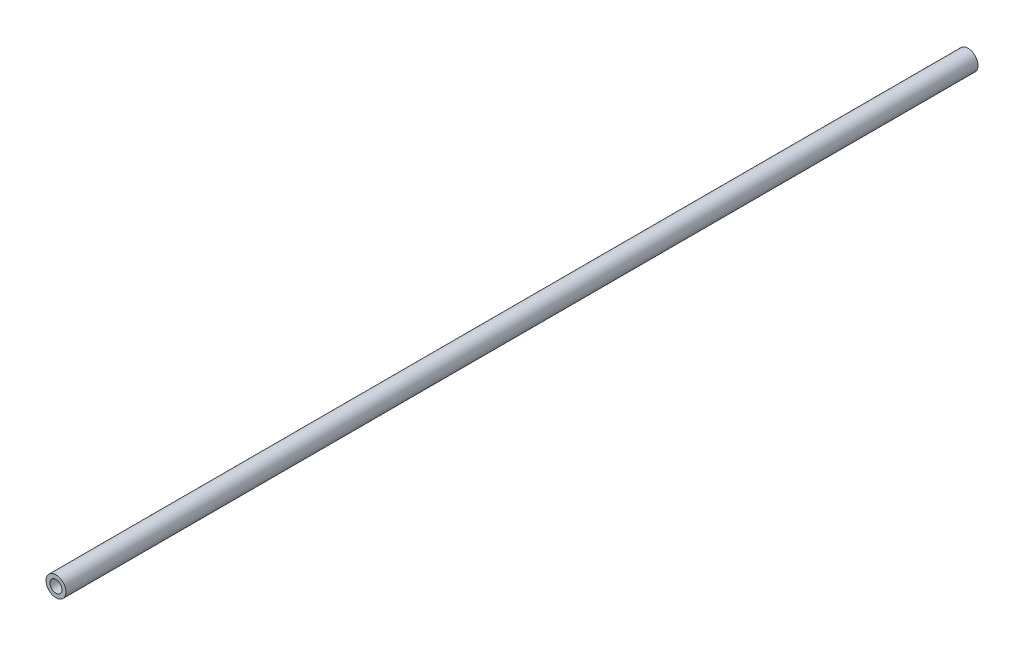
ISO-10303-21;
HEADER;
FILE_DESCRIPTION(('STEP AP214'),'2;1');
FILE_NAME('part.step','',(''),(''),'','','');
FILE_SCHEMA(('AUTOMOTIVE_DESIGN { 1 0 10303 214 1 1 1 1 }'));
ENDSEC;
DATA;
#1=APPLICATION_CONTEXT('core data for automotive mechanical design processes');
#2=APPLICATION_PROTOCOL_DEFINITION('international standard','automotive_design',2000,#1);
#3=PRODUCT_CONTEXT('',#1,'mechanical');
#4=PRODUCT('Part','Part','',(#3));
#5=PRODUCT_RELATED_PRODUCT_CATEGORY('part','',(#4));
#6=PRODUCT_DEFINITION_FORMATION('','',#4);
#7=PRODUCT_DEFINITION_CONTEXT('part definition',#1,'design');
#8=PRODUCT_DEFINITION('design','',#6,#7);
#9=PRODUCT_DEFINITION_SHAPE('','',#8);
#10=(LENGTH_UNIT() NAMED_UNIT(*) SI_UNIT(.MILLI.,.METRE.));
#11=(NAMED_UNIT(*) PLANE_ANGLE_UNIT() SI_UNIT($,.RADIAN.));
#12=(NAMED_UNIT(*) SI_UNIT($,.STERADIAN.) SOLID_ANGLE_UNIT());
#13=UNCERTAINTY_MEASURE_WITH_UNIT(LENGTH_MEASURE(1.E-05),#10,'distance_accuracy_value','');
#14=(GEOMETRIC_REPRESENTATION_CONTEXT(3) GLOBAL_UNCERTAINTY_ASSIGNED_CONTEXT((#13)) GLOBAL_UNIT_ASSIGNED_CONTEXT((#10,
#11,#12)) REPRESENTATION_CONTEXT('',''));
#15=CARTESIAN_POINT('',(0.,0.,0.));
#16=DIRECTION('',(0.,0.,1.));
#17=DIRECTION('',(1.,0.,0.));
#18=AXIS2_PLACEMENT_3D('',#15,#16,#17);
#19=CARTESIAN_POINT('',(0.,0.,457.5));
#20=DIRECTION('',(0.,0.,1.));
#21=DIRECTION('',(1.,0.,0.));
#22=AXIS2_PLACEMENT_3D('',#19,#20,#21);
#23=PLANE('',#22);
#24=CARTESIAN_POINT('',(0.,0.,457.5));
#25=DIRECTION('',(0.,0.,1.));
#26=DIRECTION('',(1.,0.,0.));
#27=AXIS2_PLACEMENT_3D('',#24,#25,#26);
#28=CIRCLE('',#27,5.);
#29=CARTESIAN_POINT('',(-5.,0.,457.5));
#30=VERTEX_POINT('',#29);
#31=EDGE_CURVE('E10',#30,#30,#28,.T.);
#32=ORIENTED_EDGE('',*,*,#31,.T.);
#33=EDGE_LOOP('',(#32));
#34=FACE_BOUND('',#33,.T.);
#35=CARTESIAN_POINT('',(0.,0.,457.5));
#36=DIRECTION('',(0.,0.,1.));
#37=DIRECTION('',(1.,0.,0.));
#38=AXIS2_PLACEMENT_3D('',#35,#36,#37);
#39=CIRCLE('',#38,3.);
#40=CARTESIAN_POINT('',(-3.,0.,457.5));
#41=VERTEX_POINT('',#40);
#42=EDGE_CURVE('E49',#41,#41,#39,.T.);
#43=ORIENTED_EDGE('',*,*,#42,.F.);
#44=EDGE_LOOP('',(#43));
#45=FACE_BOUND('',#44,.T.);
#46=ADVANCED_FACE('F38',(#34,#45),#23,.T.);
#47=CARTESIAN_POINT('',(0.,0.,0.));
#48=DIRECTION('',(0.,0.,1.));
#49=DIRECTION('',(1.,0.,0.));
#50=AXIS2_PLACEMENT_3D('',#47,#48,#49);
#51=PLANE('',#50);
#52=CARTESIAN_POINT('',(0.,0.,0.));
#53=DIRECTION('',(0.,0.,1.));
#54=DIRECTION('',(1.,0.,0.));
#55=AXIS2_PLACEMENT_3D('',#52,#53,#54);
#56=CIRCLE('',#55,5.);
#57=CARTESIAN_POINT('',(-5.,0.,0.));
#58=VERTEX_POINT('',#57);
#59=EDGE_CURVE('E42',#58,#58,#56,.T.);
#60=ORIENTED_EDGE('',*,*,#59,.F.);
#61=EDGE_LOOP('',(#60));
#62=FACE_BOUND('',#61,.T.);
#63=CARTESIAN_POINT('',(0.,0.,0.));
#64=DIRECTION('',(0.,0.,1.));
#65=DIRECTION('',(1.,0.,0.));
#66=AXIS2_PLACEMENT_3D('',#63,#64,#65);
#67=CIRCLE('',#66,3.);
#68=CARTESIAN_POINT('',(-3.,0.,0.));
#69=VERTEX_POINT('',#68);
#70=EDGE_CURVE('E51',#69,#69,#67,.T.);
#71=ORIENTED_EDGE('',*,*,#70,.T.);
#72=EDGE_LOOP('',(#71));
#73=FACE_BOUND('',#72,.T.);
#74=ADVANCED_FACE('F61',(#62,#73),#51,.F.);
#75=CARTESIAN_POINT('',(0.,0.,457.5));
#76=DIRECTION('',(0.,0.,-1.));
#77=DIRECTION('',(-1.,0.,0.));
#78=AXIS2_PLACEMENT_3D('',#75,#76,#77);
#79=CYLINDRICAL_SURFACE('',#78,5.);
#80=CARTESIAN_POINT('',(-5.,0.,457.5));
#81=CARTESIAN_POINT('',(-5.,0.,452.734375));
#82=CARTESIAN_POINT('',(-5.,0.,447.96875));
#83=CARTESIAN_POINT('',(-5.,0.,438.4375));
#84=CARTESIAN_POINT('',(-5.,0.,433.671875));
#85=CARTESIAN_POINT('',(-5.,0.,424.140625));
#86=CARTESIAN_POINT('',(-5.,0.,419.375));
#87=CARTESIAN_POINT('',(-5.,0.,409.84375));
#88=CARTESIAN_POINT('',(-5.,0.,405.078125));
#89=CARTESIAN_POINT('',(-5.,0.,395.546875));
#90=CARTESIAN_POINT('',(-5.,0.,390.78125));
#91=CARTESIAN_POINT('',(-5.,0.,381.25));
#92=CARTESIAN_POINT('',(-5.,0.,376.484375));
#93=CARTESIAN_POINT('',(-5.,0.,366.953125));
#94=CARTESIAN_POINT('',(-5.,0.,362.1875));
#95=CARTESIAN_POINT('',(-5.,0.,352.65625));
#96=CARTESIAN_POINT('',(-5.,0.,347.890625));
#97=CARTESIAN_POINT('',(-5.,0.,338.359375));
#98=CARTESIAN_POINT('',(-5.,0.,333.59375));
#99=CARTESIAN_POINT('',(-5.,0.,324.0625));
#100=CARTESIAN_POINT('',(-5.,0.,319.296875));
#101=CARTESIAN_POINT('',(-5.,0.,309.765625));
#102=CARTESIAN_POINT('',(-5.,0.,305.));
#103=CARTESIAN_POINT('',(-5.,0.,295.46875));
#104=CARTESIAN_POINT('',(-5.,0.,290.703125));
#105=CARTESIAN_POINT('',(-5.,0.,281.171875));
#106=CARTESIAN_POINT('',(-5.,0.,276.40625));
#107=CARTESIAN_POINT('',(-5.,0.,266.875));
#108=CARTESIAN_POINT('',(-5.,0.,262.109375));
#109=CARTESIAN_POINT('',(-5.,0.,252.578125));
#110=CARTESIAN_POINT('',(-5.,0.,247.8125));
#111=CARTESIAN_POINT('',(-5.,0.,238.28125));
#112=CARTESIAN_POINT('',(-5.,0.,233.515625));
#113=CARTESIAN_POINT('',(-5.,0.,223.984375));
#114=CARTESIAN_POINT('',(-5.,0.,219.21875));
#115=CARTESIAN_POINT('',(-5.,0.,209.6875));
#116=CARTESIAN_POINT('',(-5.,0.,204.921875));
#117=CARTESIAN_POINT('',(-5.,0.,195.390625));
#118=CARTESIAN_POINT('',(-5.,0.,190.625));
#119=CARTESIAN_POINT('',(-5.,0.,181.09375));
#120=CARTESIAN_POINT('',(-5.,0.,176.328125));
#121=CARTESIAN_POINT('',(-5.,0.,166.796875));
#122=CARTESIAN_POINT('',(-5.,0.,162.03125));
#123=CARTESIAN_POINT('',(-5.,0.,152.5));
#124=CARTESIAN_POINT('',(-5.,0.,147.734375));
#125=CARTESIAN_POINT('',(-5.,0.,138.203125));
#126=CARTESIAN_POINT('',(-5.,0.,133.4375));
#127=CARTESIAN_POINT('',(-5.,0.,123.90625));
#128=CARTESIAN_POINT('',(-5.,0.,119.140625));
#129=CARTESIAN_POINT('',(-5.,0.,109.609375));
#130=CARTESIAN_POINT('',(-5.,0.,104.84375));
#131=CARTESIAN_POINT('',(-5.,0.,95.3125));
#132=CARTESIAN_POINT('',(-5.,0.,90.546875));
#133=CARTESIAN_POINT('',(-5.,0.,81.015625));
#134=CARTESIAN_POINT('',(-5.,0.,76.2499999999999));
#135=CARTESIAN_POINT('',(-5.,0.,66.7187499999999));
#136=CARTESIAN_POINT('',(-5.,0.,61.9531249999999));
#137=CARTESIAN_POINT('',(-5.,0.,52.421875));
#138=CARTESIAN_POINT('',(-5.,0.,47.65625));
#139=CARTESIAN_POINT('',(-5.,0.,38.125));
#140=CARTESIAN_POINT('',(-5.,0.,33.359375));
#141=CARTESIAN_POINT('',(-5.,0.,23.828125));
#142=CARTESIAN_POINT('',(-5.,0.,19.0624999999999));
#143=CARTESIAN_POINT('',(-5.,0.,9.53124999999993));
#144=CARTESIAN_POINT('',(-5.,0.,4.76562499999994));
#145=CARTESIAN_POINT('',(-5.,0.,0.));
#146=B_SPLINE_CURVE_WITH_KNOTS('',3,(#80,#81,#82,#83,#84,#85,#86,#87,#88,#89,#90,#91,#92,#93,
#94,#95,#96,#97,#98,#99,#100,#101,#102,#103,#104,#105,#106,#107,#108,#109,#110,#111,#112,#113,
#114,#115,#116,#117,#118,#119,#120,#121,#122,#123,#124,#125,#126,#127,#128,#129,#130,#131,#132,
#133,#134,#135,#136,#137,#138,#139,#140,#141,#142,#143,#144,#145),.UNSPECIFIED.,.F.,.F.,(4,2,2,
2,2,2,2,2,2,2,2,2,2,2,2,2,2,2,2,2,2,2,2,2,2,2,2,2,2,2,2,2,4),(0.,14.296875,28.59375,42.890625,
57.1875,71.484375,85.78125,100.078125,114.375,128.671875,142.96875,157.265625,171.5625,
185.859375,200.15625,214.453125,228.75,243.046875,257.34375,271.640625,285.9375,300.234375,
314.53125,328.828125,343.125,357.421875,371.71875,386.015625,400.3125,414.609375,428.90625,
443.203125,457.5),.UNSPECIFIED.);
#147=EDGE_CURVE('BSEAM40',#30,#58,#146,.T.);
#148=ORIENTED_EDGE('',*,*,#31,.F.);
#149=ORIENTED_EDGE('',*,*,#59,.T.);
#150=ORIENTED_EDGE('',*,*,#147,.T.);
#151=ORIENTED_EDGE('',*,*,#147,.F.);
#152=EDGE_LOOP('',(#148,#150,#149,#151));
#153=FACE_BOUND('',#152,.T.);
#154=ADVANCED_FACE('F40',(#153),#79,.T.);
#155=CARTESIAN_POINT('',(0.,0.,457.5));
#156=DIRECTION('',(0.,0.,-1.));
#157=DIRECTION('',(-1.,0.,0.));
#158=AXIS2_PLACEMENT_3D('',#155,#156,#157);
#159=CYLINDRICAL_SURFACE('',#158,3.);
#160=CARTESIAN_POINT('',(-3.,0.,457.5));
#161=CARTESIAN_POINT('',(-3.,0.,452.734375));
#162=CARTESIAN_POINT('',(-3.,0.,447.96875));
#163=CARTESIAN_POINT('',(-3.,0.,438.4375));
#164=CARTESIAN_POINT('',(-3.,0.,433.671875));
#165=CARTESIAN_POINT('',(-3.,0.,424.140625));
#166=CARTESIAN_POINT('',(-3.,0.,419.375));
#167=CARTESIAN_POINT('',(-3.,0.,409.84375));
#168=CARTESIAN_POINT('',(-3.,0.,405.078125));
#169=CARTESIAN_POINT('',(-3.,0.,395.546875));
#170=CARTESIAN_POINT('',(-3.,0.,390.78125));
#171=CARTESIAN_POINT('',(-3.,0.,381.25));
#172=CARTESIAN_POINT('',(-3.,0.,376.484375));
#173=CARTESIAN_POINT('',(-3.,0.,366.953125));
#174=CARTESIAN_POINT('',(-3.,0.,362.1875));
#175=CARTESIAN_POINT('',(-3.,0.,352.65625));
#176=CARTESIAN_POINT('',(-3.,0.,347.890625));
#177=CARTESIAN_POINT('',(-3.,0.,338.359375));
#178=CARTESIAN_POINT('',(-3.,0.,333.59375));
#179=CARTESIAN_POINT('',(-3.,0.,324.0625));
#180=CARTESIAN_POINT('',(-3.,0.,319.296875));
#181=CARTESIAN_POINT('',(-3.,0.,309.765625));
#182=CARTESIAN_POINT('',(-3.,0.,305.));
#183=CARTESIAN_POINT('',(-3.,0.,295.46875));
#184=CARTESIAN_POINT('',(-3.,0.,290.703125));
#185=CARTESIAN_POINT('',(-3.,0.,281.171875));
#186=CARTESIAN_POINT('',(-3.,0.,276.40625));
#187=CARTESIAN_POINT('',(-3.,0.,266.875));
#188=CARTESIAN_POINT('',(-3.,0.,262.109375));
#189=CARTESIAN_POINT('',(-3.,0.,252.578125));
#190=CARTESIAN_POINT('',(-3.,0.,247.8125));
#191=CARTESIAN_POINT('',(-3.,0.,238.28125));
#192=CARTESIAN_POINT('',(-3.,0.,233.515625));
#193=CARTESIAN_POINT('',(-3.,0.,223.984375));
#194=CARTESIAN_POINT('',(-3.,0.,219.21875));
#195=CARTESIAN_POINT('',(-3.,0.,209.6875));
#196=CARTESIAN_POINT('',(-3.,0.,204.921875));
#197=CARTESIAN_POINT('',(-3.,0.,195.390625));
#198=CARTESIAN_POINT('',(-3.,0.,190.625));
#199=CARTESIAN_POINT('',(-3.,0.,181.09375));
#200=CARTESIAN_POINT('',(-3.,0.,176.328125));
#201=CARTESIAN_POINT('',(-3.,0.,166.796875));
#202=CARTESIAN_POINT('',(-3.,0.,162.03125));
#203=CARTESIAN_POINT('',(-3.,0.,152.5));
#204=CARTESIAN_POINT('',(-3.,0.,147.734375));
#205=CARTESIAN_POINT('',(-3.,0.,138.203125));
#206=CARTESIAN_POINT('',(-3.,0.,133.4375));
#207=CARTESIAN_POINT('',(-3.,0.,123.90625));
#208=CARTESIAN_POINT('',(-3.,0.,119.140625));
#209=CARTESIAN_POINT('',(-3.,0.,109.609375));
#210=CARTESIAN_POINT('',(-3.,0.,104.84375));
#211=CARTESIAN_POINT('',(-3.,0.,95.3125));
#212=CARTESIAN_POINT('',(-3.,0.,90.546875));
#213=CARTESIAN_POINT('',(-3.,0.,81.015625));
#214=CARTESIAN_POINT('',(-3.,0.,76.25));
#215=CARTESIAN_POINT('',(-3.,0.,66.71875));
#216=CARTESIAN_POINT('',(-3.,0.,61.953125));
#217=CARTESIAN_POINT('',(-3.,0.,52.421875));
#218=CARTESIAN_POINT('',(-3.,0.,47.65625));
#219=CARTESIAN_POINT('',(-3.,0.,38.125));
#220=CARTESIAN_POINT('',(-3.,0.,33.359375));
#221=CARTESIAN_POINT('',(-3.,0.,23.828125));
#222=CARTESIAN_POINT('',(-3.,0.,19.0624999999999));
#223=CARTESIAN_POINT('',(-3.,0.,9.53124999999993));
#224=CARTESIAN_POINT('',(-3.,0.,4.76562499999994));
#225=CARTESIAN_POINT('',(-3.,0.,0.));
#226=B_SPLINE_CURVE_WITH_KNOTS('',3,(#160,#161,#162,#163,#164,#165,#166,#167,#168,#169,#170,
#171,#172,#173,#174,#175,#176,#177,#178,#179,#180,#181,#182,#183,#184,#185,#186,#187,#188,#189,
#190,#191,#192,#193,#194,#195,#196,#197,#198,#199,#200,#201,#202,#203,#204,#205,#206,#207,#208,
#209,#210,#211,#212,#213,#214,#215,#216,#217,#218,#219,#220,#221,#222,#223,#224,#225),
.UNSPECIFIED.,.F.,.F.,(4,2,2,2,2,2,2,2,2,2,2,2,2,2,2,2,2,2,2,2,2,2,2,2,2,2,2,2,2,2,2,2,4),(0.,
14.296875,28.59375,42.890625,57.1875000000001,71.484375,85.78125,100.078125,114.375,128.671875,
142.96875,157.265625,171.5625,185.859375,200.15625,214.453125,228.75,243.046875,257.34375,
271.640625,285.9375,300.234375,314.53125,328.828125,343.125,357.421875,371.71875,386.015625,
400.3125,414.609375,428.90625,443.203125,457.5),.UNSPECIFIED.);
#227=EDGE_CURVE('BSEAM57',#41,#69,#226,.T.);
#228=ORIENTED_EDGE('',*,*,#42,.T.);
#229=ORIENTED_EDGE('',*,*,#70,.F.);
#230=ORIENTED_EDGE('',*,*,#227,.T.);
#231=ORIENTED_EDGE('',*,*,#227,.F.);
#232=EDGE_LOOP('',(#228,#230,#229,#231));
#233=FACE_BOUND('',#232,.T.);
#234=ADVANCED_FACE('F57',(#233),#159,.F.);
#235=CLOSED_SHELL('',(#46,#74,#154,#234));
#236=MANIFOLD_SOLID_BREP('B2',#235);
#237=ADVANCED_BREP_SHAPE_REPRESENTATION('',(#18,#236),#14);
#238=SHAPE_DEFINITION_REPRESENTATION(#9,#237);
ENDSEC;
END-ISO-10303-21;
